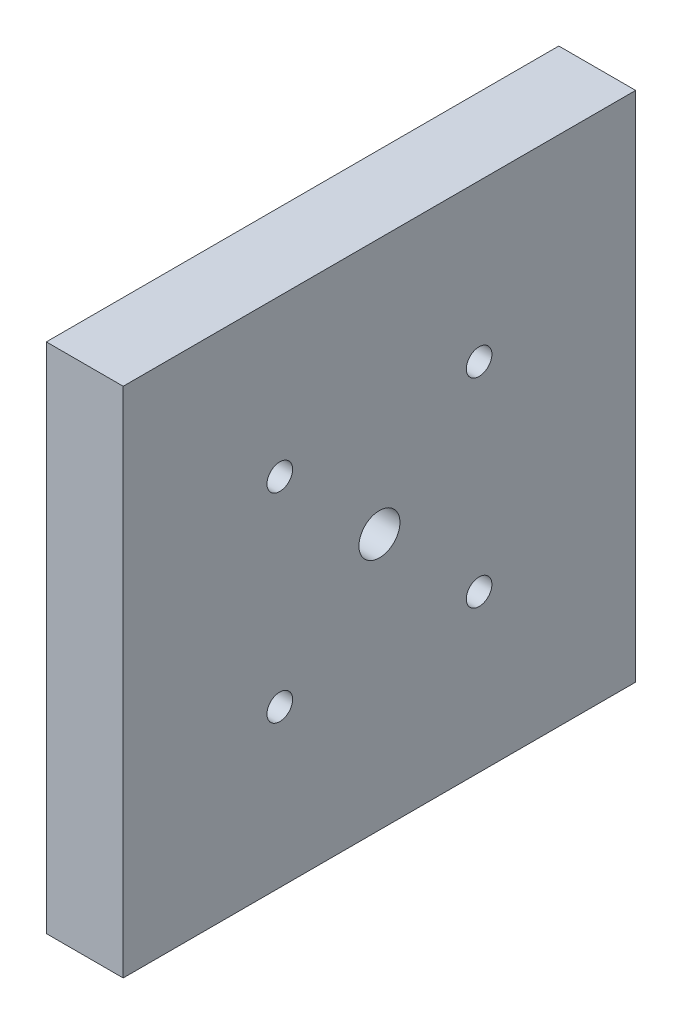
ISO-10303-21;
HEADER;
FILE_DESCRIPTION(('STEP AP214'),'2;1');
FILE_NAME('part.step','',(''),(''),'','','');
FILE_SCHEMA(('AUTOMOTIVE_DESIGN { 1 0 10303 214 1 1 1 1 }'));
ENDSEC;
DATA;
#1=APPLICATION_CONTEXT('core data for automotive mechanical design processes');
#2=APPLICATION_PROTOCOL_DEFINITION('international standard','automotive_design',2000,#1);
#3=PRODUCT_CONTEXT('',#1,'mechanical');
#4=PRODUCT('Part','Part','',(#3));
#5=PRODUCT_RELATED_PRODUCT_CATEGORY('part','',(#4));
#6=PRODUCT_DEFINITION_FORMATION('','',#4);
#7=PRODUCT_DEFINITION_CONTEXT('part definition',#1,'design');
#8=PRODUCT_DEFINITION('design','',#6,#7);
#9=PRODUCT_DEFINITION_SHAPE('','',#8);
#10=(LENGTH_UNIT() NAMED_UNIT(*) SI_UNIT(.MILLI.,.METRE.));
#11=(NAMED_UNIT(*) PLANE_ANGLE_UNIT() SI_UNIT($,.RADIAN.));
#12=(NAMED_UNIT(*) SI_UNIT($,.STERADIAN.) SOLID_ANGLE_UNIT());
#13=UNCERTAINTY_MEASURE_WITH_UNIT(LENGTH_MEASURE(1.E-05),#10,'distance_accuracy_value','');
#14=(GEOMETRIC_REPRESENTATION_CONTEXT(3) GLOBAL_UNCERTAINTY_ASSIGNED_CONTEXT((#13)) GLOBAL_UNIT_ASSIGNED_CONTEXT((#10,
#11,#12)) REPRESENTATION_CONTEXT('',''));
#15=CARTESIAN_POINT('',(0.,0.,0.));
#16=DIRECTION('',(0.,0.,1.));
#17=DIRECTION('',(1.,0.,0.));
#18=AXIS2_PLACEMENT_3D('',#15,#16,#17);
#19=CARTESIAN_POINT('',(15.,0.,0.));
#20=DIRECTION('',(1.,0.,0.));
#21=DIRECTION('',(0.,0.,-1.));
#22=AXIS2_PLACEMENT_3D('',#19,#20,#21);
#23=PLANE('',#22);
#24=CARTESIAN_POINT('',(15.,19.4454364826309,-19.4454364826301));
#25=DIRECTION('',(1.,0.,0.));
#26=DIRECTION('',(0.,0.,-1.));
#27=AXIS2_PLACEMENT_3D('',#24,#25,#26);
#28=CIRCLE('',#27,2.5);
#29=CARTESIAN_POINT('',(15.,19.4454364826309,-21.9454364826301));
#30=VERTEX_POINT('',#29);
#31=EDGE_CURVE('E137',#30,#30,#28,.T.);
#32=ORIENTED_EDGE('',*,*,#31,.F.);
#33=EDGE_LOOP('',(#32));
#34=FACE_BOUND('',#33,.T.);
#35=CARTESIAN_POINT('',(15.,-19.4454364826292,-19.4454364826301));
#36=DIRECTION('',(1.,0.,0.));
#37=DIRECTION('',(0.,0.,-1.));
#38=AXIS2_PLACEMENT_3D('',#35,#36,#37);
#39=CIRCLE('',#38,2.5);
#40=CARTESIAN_POINT('',(15.,-19.4454364826292,-21.9454364826301));
#41=VERTEX_POINT('',#40);
#42=EDGE_CURVE('E131',#41,#41,#39,.T.);
#43=ORIENTED_EDGE('',*,*,#42,.F.);
#44=EDGE_LOOP('',(#43));
#45=FACE_BOUND('',#44,.T.);
#46=CARTESIAN_POINT('',(15.,-19.4454364826292,19.4454364826301));
#47=DIRECTION('',(1.,0.,0.));
#48=DIRECTION('',(0.,0.,-1.));
#49=AXIS2_PLACEMENT_3D('',#46,#47,#48);
#50=CIRCLE('',#49,2.5);
#51=CARTESIAN_POINT('',(15.,-19.4454364826292,16.9454364826301));
#52=VERTEX_POINT('',#51);
#53=EDGE_CURVE('E125',#52,#52,#50,.T.);
#54=ORIENTED_EDGE('',*,*,#53,.F.);
#55=EDGE_LOOP('',(#54));
#56=FACE_BOUND('',#55,.T.);
#57=CARTESIAN_POINT('',(15.,19.4454364826309,19.4454364826301));
#58=DIRECTION('',(1.,0.,0.));
#59=DIRECTION('',(0.,0.,-1.));
#60=AXIS2_PLACEMENT_3D('',#57,#58,#59);
#61=CIRCLE('',#60,2.5);
#62=CARTESIAN_POINT('',(15.,19.4454364826309,16.9454364826301));
#63=VERTEX_POINT('',#62);
#64=EDGE_CURVE('E119',#63,#63,#61,.T.);
#65=ORIENTED_EDGE('',*,*,#64,.F.);
#66=EDGE_LOOP('',(#65));
#67=FACE_BOUND('',#66,.T.);
#68=DIRECTION('',(0.,-1.,0.));
#69=VECTOR('',#68,1.);
#70=CARTESIAN_POINT('',(15.,50.,50.));
#71=LINE('',#70,#69);
#72=CARTESIAN_POINT('',(15.,50.,50.));
#73=VERTEX_POINT('',#72);
#74=CARTESIAN_POINT('',(15.,-50.,50.));
#75=VERTEX_POINT('',#74);
#76=EDGE_CURVE('E86',#73,#75,#71,.T.);
#77=ORIENTED_EDGE('',*,*,#76,.T.);
#78=DIRECTION('',(0.,0.,-1.));
#79=VECTOR('',#78,1.);
#80=CARTESIAN_POINT('',(15.,-50.,50.));
#81=LINE('',#80,#79);
#82=CARTESIAN_POINT('',(15.,-50.,-50.));
#83=VERTEX_POINT('',#82);
#84=EDGE_CURVE('E81',#75,#83,#81,.T.);
#85=ORIENTED_EDGE('',*,*,#84,.T.);
#86=DIRECTION('',(0.,1.,0.));
#87=VECTOR('',#86,1.);
#88=CARTESIAN_POINT('',(15.,50.,-50.));
#89=LINE('',#88,#87);
#90=CARTESIAN_POINT('',(15.,50.,-50.));
#91=VERTEX_POINT('',#90);
#92=EDGE_CURVE('E84',#83,#91,#89,.T.);
#93=ORIENTED_EDGE('',*,*,#92,.T.);
#94=DIRECTION('',(0.,0.,1.));
#95=VECTOR('',#94,1.);
#96=CARTESIAN_POINT('',(15.,50.,50.));
#97=LINE('',#96,#95);
#98=EDGE_CURVE('E51',#91,#73,#97,.T.);
#99=ORIENTED_EDGE('',*,*,#98,.T.);
#100=EDGE_LOOP('',(#77,#85,#93,#99));
#101=FACE_BOUND('',#100,.T.);
#102=CARTESIAN_POINT('',(15.,0.,0.));
#103=DIRECTION('',(1.,0.,0.));
#104=DIRECTION('',(0.,0.,-1.));
#105=AXIS2_PLACEMENT_3D('',#102,#103,#104);
#106=CIRCLE('',#105,4.);
#107=CARTESIAN_POINT('',(15.,0.,-4.));
#108=VERTEX_POINT('',#107);
#109=EDGE_CURVE('E101',#108,#108,#106,.T.);
#110=ORIENTED_EDGE('',*,*,#109,.F.);
#111=EDGE_LOOP('',(#110));
#112=FACE_BOUND('',#111,.T.);
#113=ADVANCED_FACE('F34',(#34,#45,#56,#67,#101,#112),#23,.T.);
#114=CARTESIAN_POINT('',(0.,0.,0.));
#115=DIRECTION('',(1.,0.,0.));
#116=DIRECTION('',(0.,0.,-1.));
#117=AXIS2_PLACEMENT_3D('',#114,#115,#116);
#118=PLANE('',#117);
#119=CARTESIAN_POINT('',(0.,19.4454364826309,-19.4454364826301));
#120=DIRECTION('',(1.,0.,0.));
#121=DIRECTION('',(0.,0.,-1.));
#122=AXIS2_PLACEMENT_3D('',#119,#120,#121);
#123=CIRCLE('',#122,2.5);
#124=CARTESIAN_POINT('',(0.,19.4454364826309,-21.9454364826301));
#125=VERTEX_POINT('',#124);
#126=EDGE_CURVE('E122',#125,#125,#123,.T.);
#127=ORIENTED_EDGE('',*,*,#126,.T.);
#128=EDGE_LOOP('',(#127));
#129=FACE_BOUND('',#128,.T.);
#130=CARTESIAN_POINT('',(0.,-19.4454364826292,-19.4454364826301));
#131=DIRECTION('',(1.,0.,0.));
#132=DIRECTION('',(0.,0.,-1.));
#133=AXIS2_PLACEMENT_3D('',#130,#131,#132);
#134=CIRCLE('',#133,2.5);
#135=CARTESIAN_POINT('',(0.,-19.4454364826292,-21.9454364826301));
#136=VERTEX_POINT('',#135);
#137=EDGE_CURVE('E134',#136,#136,#134,.T.);
#138=ORIENTED_EDGE('',*,*,#137,.T.);
#139=EDGE_LOOP('',(#138));
#140=FACE_BOUND('',#139,.T.);
#141=CARTESIAN_POINT('',(0.,-19.4454364826292,19.4454364826301));
#142=DIRECTION('',(1.,0.,0.));
#143=DIRECTION('',(0.,0.,-1.));
#144=AXIS2_PLACEMENT_3D('',#141,#142,#143);
#145=CIRCLE('',#144,2.5);
#146=CARTESIAN_POINT('',(0.,-19.4454364826292,16.9454364826301));
#147=VERTEX_POINT('',#146);
#148=EDGE_CURVE('E128',#147,#147,#145,.T.);
#149=ORIENTED_EDGE('',*,*,#148,.T.);
#150=EDGE_LOOP('',(#149));
#151=FACE_BOUND('',#150,.T.);
#152=CARTESIAN_POINT('',(0.,19.4454364826309,19.4454364826301));
#153=DIRECTION('',(1.,0.,0.));
#154=DIRECTION('',(0.,0.,-1.));
#155=AXIS2_PLACEMENT_3D('',#152,#153,#154);
#156=CIRCLE('',#155,2.5);
#157=CARTESIAN_POINT('',(0.,19.4454364826309,16.9454364826301));
#158=VERTEX_POINT('',#157);
#159=EDGE_CURVE('E116',#158,#158,#156,.T.);
#160=ORIENTED_EDGE('',*,*,#159,.T.);
#161=EDGE_LOOP('',(#160));
#162=FACE_BOUND('',#161,.T.);
#163=DIRECTION('',(0.,-1.,0.));
#164=VECTOR('',#163,1.);
#165=CARTESIAN_POINT('',(0.,50.,50.));
#166=LINE('',#165,#164);
#167=CARTESIAN_POINT('',(0.,50.,50.));
#168=VERTEX_POINT('',#167);
#169=CARTESIAN_POINT('',(0.,-50.,50.));
#170=VERTEX_POINT('',#169);
#171=EDGE_CURVE('E98',#168,#170,#166,.T.);
#172=ORIENTED_EDGE('',*,*,#171,.F.);
#173=DIRECTION('',(0.,0.,1.));
#174=VECTOR('',#173,1.);
#175=CARTESIAN_POINT('',(0.,50.,50.));
#176=LINE('',#175,#174);
#177=CARTESIAN_POINT('',(0.,50.,-50.));
#178=VERTEX_POINT('',#177);
#179=EDGE_CURVE('E74',#178,#168,#176,.T.);
#180=ORIENTED_EDGE('',*,*,#179,.F.);
#181=DIRECTION('',(0.,1.,0.));
#182=VECTOR('',#181,1.);
#183=CARTESIAN_POINT('',(0.,50.,-50.));
#184=LINE('',#183,#182);
#185=CARTESIAN_POINT('',(0.,-50.,-50.));
#186=VERTEX_POINT('',#185);
#187=EDGE_CURVE('E68',#186,#178,#184,.T.);
#188=ORIENTED_EDGE('',*,*,#187,.F.);
#189=DIRECTION('',(0.,0.,-1.));
#190=VECTOR('',#189,1.);
#191=CARTESIAN_POINT('',(0.,-50.,50.));
#192=LINE('',#191,#190);
#193=EDGE_CURVE('E90',#170,#186,#192,.T.);
#194=ORIENTED_EDGE('',*,*,#193,.F.);
#195=EDGE_LOOP('',(#172,#180,#188,#194));
#196=FACE_BOUND('',#195,.T.);
#197=CARTESIAN_POINT('',(0.,0.,0.));
#198=DIRECTION('',(1.,0.,0.));
#199=DIRECTION('',(0.,0.,-1.));
#200=AXIS2_PLACEMENT_3D('',#197,#198,#199);
#201=CIRCLE('',#200,4.);
#202=CARTESIAN_POINT('',(0.,0.,-4.));
#203=VERTEX_POINT('',#202);
#204=EDGE_CURVE('E113',#203,#203,#201,.T.);
#205=ORIENTED_EDGE('',*,*,#204,.T.);
#206=EDGE_LOOP('',(#205));
#207=FACE_BOUND('',#206,.T.);
#208=ADVANCED_FACE('F109',(#129,#140,#151,#162,#196,#207),#118,.F.);
#209=CARTESIAN_POINT('',(15.,50.,50.));
#210=DIRECTION('',(0.,0.,-1.));
#211=DIRECTION('',(-1.,0.,0.));
#212=AXIS2_PLACEMENT_3D('',#209,#210,#211);
#213=PLANE('',#212);
#214=ORIENTED_EDGE('',*,*,#171,.T.);
#215=DIRECTION('',(-1.,0.,0.));
#216=VECTOR('',#215,1.);
#217=CARTESIAN_POINT('',(15.,-50.,50.));
#218=LINE('',#217,#216);
#219=EDGE_CURVE('E11',#75,#170,#218,.T.);
#220=ORIENTED_EDGE('',*,*,#219,.F.);
#221=ORIENTED_EDGE('',*,*,#76,.F.);
#222=DIRECTION('',(-1.,0.,0.));
#223=VECTOR('',#222,1.);
#224=CARTESIAN_POINT('',(15.,50.,50.));
#225=LINE('',#224,#223);
#226=EDGE_CURVE('E94',#73,#168,#225,.T.);
#227=ORIENTED_EDGE('',*,*,#226,.T.);
#228=EDGE_LOOP('',(#214,#220,#221,#227));
#229=FACE_BOUND('',#228,.T.);
#230=ADVANCED_FACE('F36',(#229),#213,.F.);
#231=CARTESIAN_POINT('',(15.,-50.,50.));
#232=DIRECTION('',(0.,1.,0.));
#233=DIRECTION('',(0.,0.,1.));
#234=AXIS2_PLACEMENT_3D('',#231,#232,#233);
#235=PLANE('',#234);
#236=ORIENTED_EDGE('',*,*,#193,.T.);
#237=DIRECTION('',(-1.,0.,0.));
#238=VECTOR('',#237,1.);
#239=CARTESIAN_POINT('',(15.,-50.,-50.));
#240=LINE('',#239,#238);
#241=EDGE_CURVE('E43',#83,#186,#240,.T.);
#242=ORIENTED_EDGE('',*,*,#241,.F.);
#243=ORIENTED_EDGE('',*,*,#84,.F.);
#244=ORIENTED_EDGE('',*,*,#219,.T.);
#245=EDGE_LOOP('',(#236,#242,#243,#244));
#246=FACE_BOUND('',#245,.T.);
#247=ADVANCED_FACE('F89',(#246),#235,.F.);
#248=CARTESIAN_POINT('',(15.,50.,-50.));
#249=DIRECTION('',(0.,0.,1.));
#250=DIRECTION('',(0.,-1.,0.));
#251=AXIS2_PLACEMENT_3D('',#248,#249,#250);
#252=PLANE('',#251);
#253=ORIENTED_EDGE('',*,*,#187,.T.);
#254=DIRECTION('',(-1.,0.,0.));
#255=VECTOR('',#254,1.);
#256=CARTESIAN_POINT('',(15.,50.,-50.));
#257=LINE('',#256,#255);
#258=EDGE_CURVE('E91',#91,#178,#257,.T.);
#259=ORIENTED_EDGE('',*,*,#258,.F.);
#260=ORIENTED_EDGE('',*,*,#92,.F.);
#261=ORIENTED_EDGE('',*,*,#241,.T.);
#262=EDGE_LOOP('',(#253,#259,#260,#261));
#263=FACE_BOUND('',#262,.T.);
#264=ADVANCED_FACE('F92',(#263),#252,.F.);
#265=CARTESIAN_POINT('',(15.,50.,50.));
#266=DIRECTION('',(0.,-1.,0.));
#267=DIRECTION('',(0.,0.,-1.));
#268=AXIS2_PLACEMENT_3D('',#265,#266,#267);
#269=PLANE('',#268);
#270=ORIENTED_EDGE('',*,*,#179,.T.);
#271=ORIENTED_EDGE('',*,*,#226,.F.);
#272=ORIENTED_EDGE('',*,*,#98,.F.);
#273=ORIENTED_EDGE('',*,*,#258,.T.);
#274=EDGE_LOOP('',(#270,#271,#272,#273));
#275=FACE_BOUND('',#274,.T.);
#276=ADVANCED_FACE('F106',(#275),#269,.F.);
#277=CARTESIAN_POINT('',(15.,0.,0.));
#278=DIRECTION('',(-1.,0.,0.));
#279=DIRECTION('',(0.,0.,1.));
#280=AXIS2_PLACEMENT_3D('',#277,#278,#279);
#281=CYLINDRICAL_SURFACE('',#280,4.);
#282=ORIENTED_EDGE('',*,*,#109,.T.);
#283=EDGE_LOOP('',(#282));
#284=FACE_BOUND('',#283,.T.);
#285=ORIENTED_EDGE('',*,*,#204,.F.);
#286=EDGE_LOOP('',(#285));
#287=FACE_BOUND('',#286,.T.);
#288=ADVANCED_FACE('F164',(#284,#287),#281,.F.);
#289=CARTESIAN_POINT('',(0.,19.4454364826309,19.4454364826301));
#290=DIRECTION('',(1.,0.,0.));
#291=DIRECTION('',(0.,0.,-1.));
#292=AXIS2_PLACEMENT_3D('',#289,#290,#291);
#293=CYLINDRICAL_SURFACE('',#292,2.5);
#294=ORIENTED_EDGE('',*,*,#159,.F.);
#295=EDGE_LOOP('',(#294));
#296=FACE_BOUND('',#295,.T.);
#297=ORIENTED_EDGE('',*,*,#64,.T.);
#298=EDGE_LOOP('',(#297));
#299=FACE_BOUND('',#298,.T.);
#300=ADVANCED_FACE('F161',(#296,#299),#293,.F.);
#301=CARTESIAN_POINT('',(0.,-19.4454364826292,19.4454364826301));
#302=DIRECTION('',(1.,0.,0.));
#303=DIRECTION('',(0.,0.,-1.));
#304=AXIS2_PLACEMENT_3D('',#301,#302,#303);
#305=CYLINDRICAL_SURFACE('',#304,2.5);
#306=ORIENTED_EDGE('',*,*,#148,.F.);
#307=EDGE_LOOP('',(#306));
#308=FACE_BOUND('',#307,.T.);
#309=ORIENTED_EDGE('',*,*,#53,.T.);
#310=EDGE_LOOP('',(#309));
#311=FACE_BOUND('',#310,.T.);
#312=ADVANCED_FACE('F163',(#308,#311),#305,.F.);
#313=CARTESIAN_POINT('',(0.,-19.4454364826292,-19.4454364826301));
#314=DIRECTION('',(1.,0.,0.));
#315=DIRECTION('',(0.,0.,-1.));
#316=AXIS2_PLACEMENT_3D('',#313,#314,#315);
#317=CYLINDRICAL_SURFACE('',#316,2.5);
#318=ORIENTED_EDGE('',*,*,#137,.F.);
#319=EDGE_LOOP('',(#318));
#320=FACE_BOUND('',#319,.T.);
#321=ORIENTED_EDGE('',*,*,#42,.T.);
#322=EDGE_LOOP('',(#321));
#323=FACE_BOUND('',#322,.T.);
#324=ADVANCED_FACE('F148',(#320,#323),#317,.F.);
#325=CARTESIAN_POINT('',(0.,19.4454364826309,-19.4454364826301));
#326=DIRECTION('',(1.,0.,0.));
#327=DIRECTION('',(0.,0.,-1.));
#328=AXIS2_PLACEMENT_3D('',#325,#326,#327);
#329=CYLINDRICAL_SURFACE('',#328,2.5);
#330=ORIENTED_EDGE('',*,*,#126,.F.);
#331=EDGE_LOOP('',(#330));
#332=FACE_BOUND('',#331,.T.);
#333=ORIENTED_EDGE('',*,*,#31,.T.);
#334=EDGE_LOOP('',(#333));
#335=FACE_BOUND('',#334,.T.);
#336=ADVANCED_FACE('F145',(#332,#335),#329,.F.);
#337=CLOSED_SHELL('',(#113,#208,#230,#247,#264,#276,#288,#300,#312,#324,#336));
#338=MANIFOLD_SOLID_BREP('B2',#337);
#339=ADVANCED_BREP_SHAPE_REPRESENTATION('',(#18,#338),#14);
#340=SHAPE_DEFINITION_REPRESENTATION(#9,#339);
ENDSEC;
END-ISO-10303-21;
